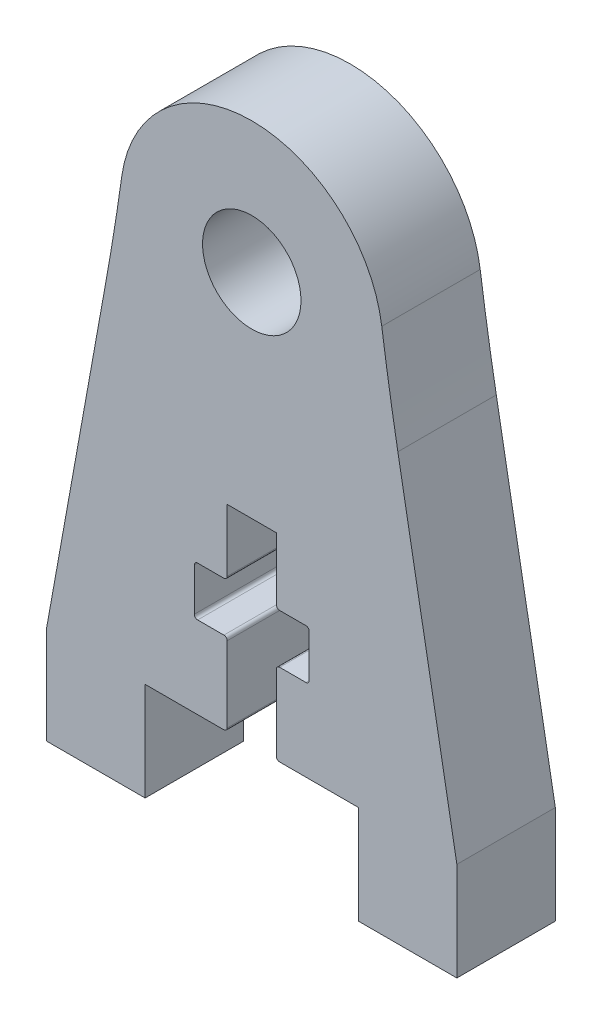
ISO-10303-21;
HEADER;
FILE_DESCRIPTION(('STEP AP214'),'2;1');
FILE_NAME('part.step','',(''),(''),'','','');
FILE_SCHEMA(('AUTOMOTIVE_DESIGN { 1 0 10303 214 1 1 1 1 }'));
ENDSEC;
DATA;
#1=APPLICATION_CONTEXT('core data for automotive mechanical design processes');
#2=APPLICATION_PROTOCOL_DEFINITION('international standard','automotive_design',2000,#1);
#3=PRODUCT_CONTEXT('',#1,'mechanical');
#4=PRODUCT('Part','Part','',(#3));
#5=PRODUCT_RELATED_PRODUCT_CATEGORY('part','',(#4));
#6=PRODUCT_DEFINITION_FORMATION('','',#4);
#7=PRODUCT_DEFINITION_CONTEXT('part definition',#1,'design');
#8=PRODUCT_DEFINITION('design','',#6,#7);
#9=PRODUCT_DEFINITION_SHAPE('','',#8);
#10=(LENGTH_UNIT() NAMED_UNIT(*) SI_UNIT(.MILLI.,.METRE.));
#11=(NAMED_UNIT(*) PLANE_ANGLE_UNIT() SI_UNIT($,.RADIAN.));
#12=(NAMED_UNIT(*) SI_UNIT($,.STERADIAN.) SOLID_ANGLE_UNIT());
#13=UNCERTAINTY_MEASURE_WITH_UNIT(LENGTH_MEASURE(1.E-05),#10,'distance_accuracy_value','');
#14=(GEOMETRIC_REPRESENTATION_CONTEXT(3) GLOBAL_UNCERTAINTY_ASSIGNED_CONTEXT((#13)) GLOBAL_UNIT_ASSIGNED_CONTEXT((#10,
#11,#12)) REPRESENTATION_CONTEXT('',''));
#15=CARTESIAN_POINT('',(0.,0.,0.));
#16=DIRECTION('',(0.,0.,1.));
#17=DIRECTION('',(1.,0.,0.));
#18=AXIS2_PLACEMENT_3D('',#15,#16,#17);
#19=CARTESIAN_POINT('',(0.,0.,6.));
#20=DIRECTION('',(0.,1.,0.));
#21=DIRECTION('',(0.,0.,1.));
#22=AXIS2_PLACEMENT_3D('',#19,#20,#21);
#23=PLANE('',#22);
#24=DIRECTION('',(1.,0.,0.));
#25=VECTOR('',#24,1.);
#26=CARTESIAN_POINT('',(0.,0.,6.));
#27=LINE('',#26,#25);
#28=CARTESIAN_POINT('',(-10.8,0.,6.));
#29=VERTEX_POINT('',#28);
#30=CARTESIAN_POINT('',(-6.,0.,6.));
#31=VERTEX_POINT('',#30);
#32=EDGE_CURVE('E474',#29,#31,#27,.T.);
#33=ORIENTED_EDGE('',*,*,#32,.F.);
#34=DIRECTION('',(0.,0.,1.));
#35=VECTOR('',#34,1.);
#36=CARTESIAN_POINT('',(-10.8,0.,6.));
#37=LINE('',#36,#35);
#38=CARTESIAN_POINT('',(-10.8,0.,0.));
#39=VERTEX_POINT('',#38);
#40=EDGE_CURVE('E516',#29,#39,#37,.F.);
#41=ORIENTED_EDGE('',*,*,#40,.T.);
#42=DIRECTION('',(1.,0.,0.));
#43=VECTOR('',#42,1.);
#44=CARTESIAN_POINT('',(0.,0.,0.));
#45=LINE('',#44,#43);
#46=CARTESIAN_POINT('',(-6.,0.,0.));
#47=VERTEX_POINT('',#46);
#48=EDGE_CURVE('E485',#39,#47,#45,.T.);
#49=ORIENTED_EDGE('',*,*,#48,.T.);
#50=DIRECTION('',(0.,0.,-1.));
#51=VECTOR('',#50,1.);
#52=CARTESIAN_POINT('',(-6.,0.,6.));
#53=LINE('',#52,#51);
#54=EDGE_CURVE('E278',#31,#47,#53,.T.);
#55=ORIENTED_EDGE('',*,*,#54,.F.);
#56=EDGE_LOOP('',(#33,#41,#49,#55));
#57=FACE_BOUND('',#56,.T.);
#58=ADVANCED_FACE('F33',(#57),#23,.F.);
#59=CARTESIAN_POINT('',(-19.,0.,0.));
#60=VERTEX_POINT('',#59);
#61=CARTESIAN_POINT('',(-14.2,0.,0.));
#62=VERTEX_POINT('',#61);
#63=EDGE_CURVE('E469',#60,#62,#45,.T.);
#64=ORIENTED_EDGE('',*,*,#63,.T.);
#65=DIRECTION('',(0.,0.,1.));
#66=VECTOR('',#65,1.);
#67=CARTESIAN_POINT('',(-14.2,0.,6.));
#68=LINE('',#67,#66);
#69=CARTESIAN_POINT('',(-14.2,0.,6.));
#70=VERTEX_POINT('',#69);
#71=EDGE_CURVE('E41',#62,#70,#68,.T.);
#72=ORIENTED_EDGE('',*,*,#71,.T.);
#73=CARTESIAN_POINT('',(-19.,0.,6.));
#74=VERTEX_POINT('',#73);
#75=EDGE_CURVE('E475',#74,#70,#27,.T.);
#76=ORIENTED_EDGE('',*,*,#75,.F.);
#77=DIRECTION('',(0.,0.,1.));
#78=VECTOR('',#77,1.);
#79=CARTESIAN_POINT('',(-19.,0.,6.));
#80=LINE('',#79,#78);
#81=EDGE_CURVE('E283',#60,#74,#80,.T.);
#82=ORIENTED_EDGE('',*,*,#81,.F.);
#83=EDGE_LOOP('',(#64,#72,#76,#82));
#84=FACE_BOUND('',#83,.T.);
#85=ADVANCED_FACE('F523',(#84),#23,.F.);
#86=CARTESIAN_POINT('',(-12.5,25.,6.));
#87=DIRECTION('',(0.,0.,-1.));
#88=DIRECTION('',(-1.,0.,0.));
#89=AXIS2_PLACEMENT_3D('',#86,#87,#88);
#90=PLANE('',#89);
#91=DIRECTION('',(0.,1.,0.));
#92=VECTOR('',#91,1.);
#93=CARTESIAN_POINT('',(-11.,4.8,6.));
#94=LINE('',#93,#92);
#95=CARTESIAN_POINT('',(-11.,0.2,6.));
#96=VERTEX_POINT('',#95);
#97=CARTESIAN_POINT('',(-11.,4.8,6.));
#98=VERTEX_POINT('',#97);
#99=EDGE_CURVE('E312',#96,#98,#94,.T.);
#100=ORIENTED_EDGE('',*,*,#99,.F.);
#101=CARTESIAN_POINT('',(-10.8,0.2,6.));
#102=DIRECTION('',(0.,0.,-1.));
#103=DIRECTION('',(-1.,0.,0.));
#104=AXIS2_PLACEMENT_3D('',#101,#102,#103);
#105=CIRCLE('',#104,0.2);
#106=EDGE_CURVE('E514',#96,#29,#105,.F.);
#107=ORIENTED_EDGE('',*,*,#106,.T.);
#108=ORIENTED_EDGE('',*,*,#32,.T.);
#109=DIRECTION('',(0.,1.,0.));
#110=VECTOR('',#109,1.);
#111=CARTESIAN_POINT('',(-6.,-6.,6.));
#112=LINE('',#111,#110);
#113=CARTESIAN_POINT('',(-6.,-6.,6.));
#114=VERTEX_POINT('',#113);
#115=EDGE_CURVE('E265',#114,#31,#112,.T.);
#116=ORIENTED_EDGE('',*,*,#115,.F.);
#117=DIRECTION('',(-1.,0.,0.));
#118=VECTOR('',#117,1.);
#119=CARTESIAN_POINT('',(0.,-6.,6.));
#120=LINE('',#119,#118);
#121=CARTESIAN_POINT('',(0.,-6.,6.));
#122=VERTEX_POINT('',#121);
#123=EDGE_CURVE('E255',#122,#114,#120,.T.);
#124=ORIENTED_EDGE('',*,*,#123,.F.);
#125=DIRECTION('',(0.,1.,0.));
#126=VECTOR('',#125,1.);
#127=CARTESIAN_POINT('',(0.,-6.,6.));
#128=LINE('',#127,#126);
#129=CARTESIAN_POINT('',(0.,0.,6.));
#130=VERTEX_POINT('',#129);
#131=EDGE_CURVE('E262',#122,#130,#128,.T.);
#132=ORIENTED_EDGE('',*,*,#131,.T.);
#133=DIRECTION('',(-0.177152998315265,0.984183323973695,0.));
#134=VECTOR('',#133,1.);
#135=CARTESIAN_POINT('',(-4.5,25.,6.));
#136=LINE('',#135,#134);
#137=CARTESIAN_POINT('',(-3.5961798990472,19.9787772169289,6.));
#138=VERTEX_POINT('',#137);
#139=EDGE_CURVE('E466',#130,#138,#136,.T.);
#140=ORIENTED_EDGE('',*,*,#139,.T.);
#141=CARTESIAN_POINT('',(153.873151936744,48.3232569473713,6.));
#142=DIRECTION('',(0.,0.,-1.));
#143=DIRECTION('',(-1.,0.,0.));
#144=AXIS2_PLACEMENT_3D('',#141,#142,#143);
#145=CIRCLE('',#144,160.);
#146=CARTESIAN_POINT('',(-4.57746895539314,26.1106312832082,6.));
#147=VERTEX_POINT('',#146);
#148=EDGE_CURVE('E507',#138,#147,#145,.T.);
#149=ORIENTED_EDGE('',*,*,#148,.T.);
#150=CARTESIAN_POINT('',(-12.5,25.,6.));
#151=DIRECTION('',(0.,0.,1.));
#152=DIRECTION('',(-1.,0.,0.));
#153=AXIS2_PLACEMENT_3D('',#150,#151,#152);
#154=CIRCLE('',#153,8.);
#155=CARTESIAN_POINT('',(-20.4225310446068,26.1106312832083,6.));
#156=VERTEX_POINT('',#155);
#157=EDGE_CURVE('E468',#147,#156,#154,.T.);
#158=ORIENTED_EDGE('',*,*,#157,.T.);
#159=CARTESIAN_POINT('',(-178.873151936744,48.3232569473734,6.));
#160=DIRECTION('',(0.,0.,-1.));
#161=DIRECTION('',(-1.,0.,0.));
#162=AXIS2_PLACEMENT_3D('',#159,#160,#161);
#163=CIRCLE('',#162,160.);
#164=CARTESIAN_POINT('',(-21.4038201009524,19.978777216931,6.));
#165=VERTEX_POINT('',#164);
#166=EDGE_CURVE('E503',#156,#165,#163,.T.);
#167=ORIENTED_EDGE('',*,*,#166,.T.);
#168=DIRECTION('',(-0.177152998315265,-0.984183323973695,0.));
#169=VECTOR('',#168,1.);
#170=CARTESIAN_POINT('',(-25.,0.,6.));
#171=LINE('',#170,#169);
#172=CARTESIAN_POINT('',(-25.,0.,6.));
#173=VERTEX_POINT('',#172);
#174=EDGE_CURVE('E472',#165,#173,#171,.T.);
#175=ORIENTED_EDGE('',*,*,#174,.T.);
#176=DIRECTION('',(0.,1.,0.));
#177=VECTOR('',#176,1.);
#178=CARTESIAN_POINT('',(-25.,-6.,6.));
#179=LINE('',#178,#177);
#180=CARTESIAN_POINT('',(-25.,-6.,6.));
#181=VERTEX_POINT('',#180);
#182=EDGE_CURVE('E299',#181,#173,#179,.T.);
#183=ORIENTED_EDGE('',*,*,#182,.F.);
#184=DIRECTION('',(-1.,0.,0.));
#185=VECTOR('',#184,1.);
#186=CARTESIAN_POINT('',(-25.,-6.,6.));
#187=LINE('',#186,#185);
#188=CARTESIAN_POINT('',(-19.,-6.,6.));
#189=VERTEX_POINT('',#188);
#190=EDGE_CURVE('E298',#189,#181,#187,.T.);
#191=ORIENTED_EDGE('',*,*,#190,.F.);
#192=DIRECTION('',(0.,1.,0.));
#193=VECTOR('',#192,1.);
#194=CARTESIAN_POINT('',(-19.,-6.,6.));
#195=LINE('',#194,#193);
#196=EDGE_CURVE('E303',#189,#74,#195,.T.);
#197=ORIENTED_EDGE('',*,*,#196,.T.);
#198=ORIENTED_EDGE('',*,*,#75,.T.);
#199=CARTESIAN_POINT('',(-14.2,0.2,6.));
#200=DIRECTION('',(0.,0.,-1.));
#201=DIRECTION('',(-1.,0.,0.));
#202=AXIS2_PLACEMENT_3D('',#199,#200,#201);
#203=CIRCLE('',#202,0.2);
#204=CARTESIAN_POINT('',(-14.,0.2,6.));
#205=VERTEX_POINT('',#204);
#206=EDGE_CURVE('E512',#70,#205,#203,.F.);
#207=ORIENTED_EDGE('',*,*,#206,.T.);
#208=DIRECTION('',(0.,-1.,0.));
#209=VECTOR('',#208,1.);
#210=CARTESIAN_POINT('',(-14.,0.,6.));
#211=LINE('',#210,#209);
#212=CARTESIAN_POINT('',(-14.,4.8,6.));
#213=VERTEX_POINT('',#212);
#214=EDGE_CURVE('E316',#213,#205,#211,.T.);
#215=ORIENTED_EDGE('',*,*,#214,.F.);
#216=CARTESIAN_POINT('',(-14.2,4.8,6.));
#217=DIRECTION('',(0.,0.,-1.));
#218=DIRECTION('',(1.,0.,0.));
#219=AXIS2_PLACEMENT_3D('',#216,#217,#218);
#220=CIRCLE('',#219,0.2);
#221=CARTESIAN_POINT('',(-14.2,5.,6.));
#222=VERTEX_POINT('',#221);
#223=EDGE_CURVE('E419',#222,#213,#220,.T.);
#224=ORIENTED_EDGE('',*,*,#223,.F.);
#225=DIRECTION('',(1.,0.,0.));
#226=VECTOR('',#225,1.);
#227=CARTESIAN_POINT('',(-14.2,5.,6.));
#228=LINE('',#227,#226);
#229=CARTESIAN_POINT('',(-15.8,5.,6.));
#230=VERTEX_POINT('',#229);
#231=EDGE_CURVE('E416',#230,#222,#228,.T.);
#232=ORIENTED_EDGE('',*,*,#231,.F.);
#233=CARTESIAN_POINT('',(-15.8,5.2,6.));
#234=DIRECTION('',(0.,0.,1.));
#235=DIRECTION('',(1.,0.,0.));
#236=AXIS2_PLACEMENT_3D('',#233,#234,#235);
#237=CIRCLE('',#236,0.199999999999999);
#238=CARTESIAN_POINT('',(-16.,5.2,6.));
#239=VERTEX_POINT('',#238);
#240=EDGE_CURVE('E413',#239,#230,#237,.T.);
#241=ORIENTED_EDGE('',*,*,#240,.F.);
#242=DIRECTION('',(0.,-1.,0.));
#243=VECTOR('',#242,1.);
#244=CARTESIAN_POINT('',(-16.,5.2,6.));
#245=LINE('',#244,#243);
#246=CARTESIAN_POINT('',(-16.,7.8,6.));
#247=VERTEX_POINT('',#246);
#248=EDGE_CURVE('E410',#247,#239,#245,.T.);
#249=ORIENTED_EDGE('',*,*,#248,.F.);
#250=CARTESIAN_POINT('',(-15.8,7.8,6.));
#251=DIRECTION('',(0.,0.,1.));
#252=DIRECTION('',(-1.,0.,0.));
#253=AXIS2_PLACEMENT_3D('',#250,#251,#252);
#254=CIRCLE('',#253,0.199999999999999);
#255=CARTESIAN_POINT('',(-15.8,8.,6.));
#256=VERTEX_POINT('',#255);
#257=EDGE_CURVE('E407',#256,#247,#254,.T.);
#258=ORIENTED_EDGE('',*,*,#257,.F.);
#259=DIRECTION('',(-1.,0.,0.));
#260=VECTOR('',#259,1.);
#261=CARTESIAN_POINT('',(-15.8,8.,6.));
#262=LINE('',#261,#260);
#263=CARTESIAN_POINT('',(-14.2,8.,6.));
#264=VERTEX_POINT('',#263);
#265=EDGE_CURVE('E404',#264,#256,#262,.T.);
#266=ORIENTED_EDGE('',*,*,#265,.F.);
#267=CARTESIAN_POINT('',(-14.2,8.2,6.));
#268=DIRECTION('',(0.,0.,-1.));
#269=DIRECTION('',(1.,0.,0.));
#270=AXIS2_PLACEMENT_3D('',#267,#268,#269);
#271=CIRCLE('',#270,0.200000000000001);
#272=CARTESIAN_POINT('',(-14.,8.2,6.));
#273=VERTEX_POINT('',#272);
#274=EDGE_CURVE('E401',#273,#264,#271,.T.);
#275=ORIENTED_EDGE('',*,*,#274,.F.);
#276=DIRECTION('',(0.,-1.,0.));
#277=VECTOR('',#276,1.);
#278=CARTESIAN_POINT('',(-14.,8.2,6.));
#279=LINE('',#278,#277);
#280=CARTESIAN_POINT('',(-14.,12.,6.));
#281=VERTEX_POINT('',#280);
#282=EDGE_CURVE('E398',#281,#273,#279,.T.);
#283=ORIENTED_EDGE('',*,*,#282,.F.);
#284=DIRECTION('',(-1.,0.,0.));
#285=VECTOR('',#284,1.);
#286=CARTESIAN_POINT('',(-14.,12.,6.));
#287=LINE('',#286,#285);
#288=CARTESIAN_POINT('',(-11.,12.,6.));
#289=VERTEX_POINT('',#288);
#290=EDGE_CURVE('E395',#289,#281,#287,.T.);
#291=ORIENTED_EDGE('',*,*,#290,.F.);
#292=DIRECTION('',(0.,1.,0.));
#293=VECTOR('',#292,1.);
#294=CARTESIAN_POINT('',(-11.,12.,6.));
#295=LINE('',#294,#293);
#296=CARTESIAN_POINT('',(-11.,8.2,6.));
#297=VERTEX_POINT('',#296);
#298=EDGE_CURVE('E392',#297,#289,#295,.T.);
#299=ORIENTED_EDGE('',*,*,#298,.F.);
#300=CARTESIAN_POINT('',(-10.8,8.2,6.));
#301=DIRECTION('',(0.,0.,-1.));
#302=DIRECTION('',(1.,0.,0.));
#303=AXIS2_PLACEMENT_3D('',#300,#301,#302);
#304=CIRCLE('',#303,0.2);
#305=CARTESIAN_POINT('',(-10.8,8.,6.));
#306=VERTEX_POINT('',#305);
#307=EDGE_CURVE('E389',#306,#297,#304,.T.);
#308=ORIENTED_EDGE('',*,*,#307,.F.);
#309=DIRECTION('',(-1.,0.,0.));
#310=VECTOR('',#309,1.);
#311=CARTESIAN_POINT('',(-10.8,8.,6.));
#312=LINE('',#311,#310);
#313=CARTESIAN_POINT('',(-9.2,8.,6.));
#314=VERTEX_POINT('',#313);
#315=EDGE_CURVE('E386',#314,#306,#312,.T.);
#316=ORIENTED_EDGE('',*,*,#315,.F.);
#317=CARTESIAN_POINT('',(-9.2,7.8,6.));
#318=DIRECTION('',(0.,0.,1.));
#319=DIRECTION('',(1.,0.,0.));
#320=AXIS2_PLACEMENT_3D('',#317,#318,#319);
#321=CIRCLE('',#320,0.2);
#322=CARTESIAN_POINT('',(-9.,7.8,6.));
#323=VERTEX_POINT('',#322);
#324=EDGE_CURVE('E383',#323,#314,#321,.T.);
#325=ORIENTED_EDGE('',*,*,#324,.F.);
#326=DIRECTION('',(0.,1.,0.));
#327=VECTOR('',#326,1.);
#328=CARTESIAN_POINT('',(-9.,7.8,6.));
#329=LINE('',#328,#327);
#330=CARTESIAN_POINT('',(-9.,5.2,6.));
#331=VERTEX_POINT('',#330);
#332=EDGE_CURVE('E380',#331,#323,#329,.T.);
#333=ORIENTED_EDGE('',*,*,#332,.F.);
#334=CARTESIAN_POINT('',(-9.2,5.2,6.));
#335=DIRECTION('',(0.,0.,1.));
#336=DIRECTION('',(-1.,0.,0.));
#337=AXIS2_PLACEMENT_3D('',#334,#335,#336);
#338=CIRCLE('',#337,0.2);
#339=CARTESIAN_POINT('',(-9.2,5.,6.));
#340=VERTEX_POINT('',#339);
#341=EDGE_CURVE('E377',#340,#331,#338,.T.);
#342=ORIENTED_EDGE('',*,*,#341,.F.);
#343=DIRECTION('',(1.,0.,0.));
#344=VECTOR('',#343,1.);
#345=CARTESIAN_POINT('',(-9.2,5.,6.));
#346=LINE('',#345,#344);
#347=CARTESIAN_POINT('',(-10.8,5.,6.));
#348=VERTEX_POINT('',#347);
#349=EDGE_CURVE('E374',#348,#340,#346,.T.);
#350=ORIENTED_EDGE('',*,*,#349,.F.);
#351=CARTESIAN_POINT('',(-10.8,4.8,6.));
#352=DIRECTION('',(0.,0.,-1.));
#353=DIRECTION('',(1.,0.,0.));
#354=AXIS2_PLACEMENT_3D('',#351,#352,#353);
#355=CIRCLE('',#354,0.2);
#356=EDGE_CURVE('E371',#98,#348,#355,.T.);
#357=ORIENTED_EDGE('',*,*,#356,.F.);
#358=EDGE_LOOP('',(#100,#107,#108,#116,#124,#132,#140,#149,#158,#167,#175,#183,#191,#197,#198,
#207,#215,#224,#232,#241,#249,#258,#266,#275,#283,#291,#299,#308,#316,#325,#333,#342,#350,#357));
#359=FACE_BOUND('',#358,.T.);
#360=CARTESIAN_POINT('',(-12.5,25.,6.));
#361=DIRECTION('',(0.,0.,1.));
#362=DIRECTION('',(1.,0.,0.));
#363=AXIS2_PLACEMENT_3D('',#360,#361,#362);
#364=CIRCLE('',#363,3.);
#365=CARTESIAN_POINT('',(-9.5,25.,6.));
#366=VERTEX_POINT('',#365);
#367=EDGE_CURVE('E460',#366,#366,#364,.T.);
#368=ORIENTED_EDGE('',*,*,#367,.F.);
#369=EDGE_LOOP('',(#368));
#370=FACE_BOUND('',#369,.T.);
#371=ADVANCED_FACE('F258',(#359,#370),#90,.F.);
#372=CARTESIAN_POINT('',(-12.5,25.,0.));
#373=DIRECTION('',(0.,0.,-1.));
#374=DIRECTION('',(-1.,0.,0.));
#375=AXIS2_PLACEMENT_3D('',#372,#373,#374);
#376=PLANE('',#375);
#377=ORIENTED_EDGE('',*,*,#48,.F.);
#378=CARTESIAN_POINT('',(-10.8,0.2,0.));
#379=DIRECTION('',(0.,0.,-1.));
#380=DIRECTION('',(-1.,0.,0.));
#381=AXIS2_PLACEMENT_3D('',#378,#379,#380);
#382=CIRCLE('',#381,0.2);
#383=CARTESIAN_POINT('',(-11.,0.2,0.));
#384=VERTEX_POINT('',#383);
#385=EDGE_CURVE('E519',#39,#384,#382,.T.);
#386=ORIENTED_EDGE('',*,*,#385,.T.);
#387=DIRECTION('',(0.,1.,0.));
#388=VECTOR('',#387,1.);
#389=CARTESIAN_POINT('',(-11.,4.8,0.));
#390=LINE('',#389,#388);
#391=CARTESIAN_POINT('',(-11.,4.8,0.));
#392=VERTEX_POINT('',#391);
#393=EDGE_CURVE('E313',#384,#392,#390,.T.);
#394=ORIENTED_EDGE('',*,*,#393,.T.);
#395=CARTESIAN_POINT('',(-10.8,4.8,0.));
#396=DIRECTION('',(0.,0.,-1.));
#397=DIRECTION('',(1.,0.,0.));
#398=AXIS2_PLACEMENT_3D('',#395,#396,#397);
#399=CIRCLE('',#398,0.2);
#400=CARTESIAN_POINT('',(-10.8,5.,0.));
#401=VERTEX_POINT('',#400);
#402=EDGE_CURVE('E315',#392,#401,#399,.T.);
#403=ORIENTED_EDGE('',*,*,#402,.T.);
#404=DIRECTION('',(1.,0.,0.));
#405=VECTOR('',#404,1.);
#406=CARTESIAN_POINT('',(-9.2,5.,0.));
#407=LINE('',#406,#405);
#408=CARTESIAN_POINT('',(-9.2,5.,0.));
#409=VERTEX_POINT('',#408);
#410=EDGE_CURVE('E319',#401,#409,#407,.T.);
#411=ORIENTED_EDGE('',*,*,#410,.T.);
#412=CARTESIAN_POINT('',(-9.2,5.2,0.));
#413=DIRECTION('',(0.,0.,1.));
#414=DIRECTION('',(-1.,0.,0.));
#415=AXIS2_PLACEMENT_3D('',#412,#413,#414);
#416=CIRCLE('',#415,0.2);
#417=CARTESIAN_POINT('',(-9.,5.2,0.));
#418=VERTEX_POINT('',#417);
#419=EDGE_CURVE('E322',#409,#418,#416,.T.);
#420=ORIENTED_EDGE('',*,*,#419,.T.);
#421=DIRECTION('',(0.,1.,0.));
#422=VECTOR('',#421,1.);
#423=CARTESIAN_POINT('',(-9.,7.8,0.));
#424=LINE('',#423,#422);
#425=CARTESIAN_POINT('',(-9.,7.8,0.));
#426=VERTEX_POINT('',#425);
#427=EDGE_CURVE('E325',#418,#426,#424,.T.);
#428=ORIENTED_EDGE('',*,*,#427,.T.);
#429=CARTESIAN_POINT('',(-9.2,7.8,0.));
#430=DIRECTION('',(0.,0.,1.));
#431=DIRECTION('',(1.,0.,0.));
#432=AXIS2_PLACEMENT_3D('',#429,#430,#431);
#433=CIRCLE('',#432,0.2);
#434=CARTESIAN_POINT('',(-9.2,8.,0.));
#435=VERTEX_POINT('',#434);
#436=EDGE_CURVE('E328',#426,#435,#433,.T.);
#437=ORIENTED_EDGE('',*,*,#436,.T.);
#438=DIRECTION('',(-1.,0.,0.));
#439=VECTOR('',#438,1.);
#440=CARTESIAN_POINT('',(-10.8,8.,0.));
#441=LINE('',#440,#439);
#442=CARTESIAN_POINT('',(-10.8,8.,0.));
#443=VERTEX_POINT('',#442);
#444=EDGE_CURVE('E331',#435,#443,#441,.T.);
#445=ORIENTED_EDGE('',*,*,#444,.T.);
#446=CARTESIAN_POINT('',(-10.8,8.2,0.));
#447=DIRECTION('',(0.,0.,-1.));
#448=DIRECTION('',(1.,0.,0.));
#449=AXIS2_PLACEMENT_3D('',#446,#447,#448);
#450=CIRCLE('',#449,0.2);
#451=CARTESIAN_POINT('',(-11.,8.2,0.));
#452=VERTEX_POINT('',#451);
#453=EDGE_CURVE('E334',#443,#452,#450,.T.);
#454=ORIENTED_EDGE('',*,*,#453,.T.);
#455=DIRECTION('',(0.,1.,0.));
#456=VECTOR('',#455,1.);
#457=CARTESIAN_POINT('',(-11.,12.,0.));
#458=LINE('',#457,#456);
#459=CARTESIAN_POINT('',(-11.,12.,0.));
#460=VERTEX_POINT('',#459);
#461=EDGE_CURVE('E337',#452,#460,#458,.T.);
#462=ORIENTED_EDGE('',*,*,#461,.T.);
#463=DIRECTION('',(-1.,0.,0.));
#464=VECTOR('',#463,1.);
#465=CARTESIAN_POINT('',(-14.,12.,0.));
#466=LINE('',#465,#464);
#467=CARTESIAN_POINT('',(-14.,12.,0.));
#468=VERTEX_POINT('',#467);
#469=EDGE_CURVE('E340',#460,#468,#466,.T.);
#470=ORIENTED_EDGE('',*,*,#469,.T.);
#471=DIRECTION('',(0.,-1.,0.));
#472=VECTOR('',#471,1.);
#473=CARTESIAN_POINT('',(-14.,8.2,0.));
#474=LINE('',#473,#472);
#475=CARTESIAN_POINT('',(-14.,8.2,0.));
#476=VERTEX_POINT('',#475);
#477=EDGE_CURVE('E343',#468,#476,#474,.T.);
#478=ORIENTED_EDGE('',*,*,#477,.T.);
#479=CARTESIAN_POINT('',(-14.2,8.2,0.));
#480=DIRECTION('',(0.,0.,-1.));
#481=DIRECTION('',(1.,0.,0.));
#482=AXIS2_PLACEMENT_3D('',#479,#480,#481);
#483=CIRCLE('',#482,0.200000000000001);
#484=CARTESIAN_POINT('',(-14.2,8.,0.));
#485=VERTEX_POINT('',#484);
#486=EDGE_CURVE('E346',#476,#485,#483,.T.);
#487=ORIENTED_EDGE('',*,*,#486,.T.);
#488=DIRECTION('',(-1.,0.,0.));
#489=VECTOR('',#488,1.);
#490=CARTESIAN_POINT('',(-15.8,8.,0.));
#491=LINE('',#490,#489);
#492=CARTESIAN_POINT('',(-15.8,8.,0.));
#493=VERTEX_POINT('',#492);
#494=EDGE_CURVE('E349',#485,#493,#491,.T.);
#495=ORIENTED_EDGE('',*,*,#494,.T.);
#496=CARTESIAN_POINT('',(-15.8,7.8,0.));
#497=DIRECTION('',(0.,0.,1.));
#498=DIRECTION('',(-1.,0.,0.));
#499=AXIS2_PLACEMENT_3D('',#496,#497,#498);
#500=CIRCLE('',#499,0.199999999999999);
#501=CARTESIAN_POINT('',(-16.,7.8,0.));
#502=VERTEX_POINT('',#501);
#503=EDGE_CURVE('E352',#493,#502,#500,.T.);
#504=ORIENTED_EDGE('',*,*,#503,.T.);
#505=DIRECTION('',(0.,-1.,0.));
#506=VECTOR('',#505,1.);
#507=CARTESIAN_POINT('',(-16.,5.2,0.));
#508=LINE('',#507,#506);
#509=CARTESIAN_POINT('',(-16.,5.2,0.));
#510=VERTEX_POINT('',#509);
#511=EDGE_CURVE('E355',#502,#510,#508,.T.);
#512=ORIENTED_EDGE('',*,*,#511,.T.);
#513=CARTESIAN_POINT('',(-15.8,5.2,0.));
#514=DIRECTION('',(0.,0.,1.));
#515=DIRECTION('',(1.,0.,0.));
#516=AXIS2_PLACEMENT_3D('',#513,#514,#515);
#517=CIRCLE('',#516,0.199999999999999);
#518=CARTESIAN_POINT('',(-15.8,5.,0.));
#519=VERTEX_POINT('',#518);
#520=EDGE_CURVE('E358',#510,#519,#517,.T.);
#521=ORIENTED_EDGE('',*,*,#520,.T.);
#522=DIRECTION('',(1.,0.,0.));
#523=VECTOR('',#522,1.);
#524=CARTESIAN_POINT('',(-14.2,5.,0.));
#525=LINE('',#524,#523);
#526=CARTESIAN_POINT('',(-14.2,5.,0.));
#527=VERTEX_POINT('',#526);
#528=EDGE_CURVE('E361',#519,#527,#525,.T.);
#529=ORIENTED_EDGE('',*,*,#528,.T.);
#530=CARTESIAN_POINT('',(-14.2,4.8,0.));
#531=DIRECTION('',(0.,0.,-1.));
#532=DIRECTION('',(1.,0.,0.));
#533=AXIS2_PLACEMENT_3D('',#530,#531,#532);
#534=CIRCLE('',#533,0.2);
#535=CARTESIAN_POINT('',(-14.,4.8,0.));
#536=VERTEX_POINT('',#535);
#537=EDGE_CURVE('E364',#527,#536,#534,.T.);
#538=ORIENTED_EDGE('',*,*,#537,.T.);
#539=DIRECTION('',(0.,-1.,0.));
#540=VECTOR('',#539,1.);
#541=CARTESIAN_POINT('',(-14.,0.,0.));
#542=LINE('',#541,#540);
#543=CARTESIAN_POINT('',(-14.,0.2,0.));
#544=VERTEX_POINT('',#543);
#545=EDGE_CURVE('E367',#536,#544,#542,.T.);
#546=ORIENTED_EDGE('',*,*,#545,.T.);
#547=CARTESIAN_POINT('',(-14.2,0.2,0.));
#548=DIRECTION('',(0.,0.,-1.));
#549=DIRECTION('',(-1.,0.,0.));
#550=AXIS2_PLACEMENT_3D('',#547,#548,#549);
#551=CIRCLE('',#550,0.2);
#552=EDGE_CURVE('E48',#544,#62,#551,.T.);
#553=ORIENTED_EDGE('',*,*,#552,.T.);
#554=ORIENTED_EDGE('',*,*,#63,.F.);
#555=DIRECTION('',(0.,1.,0.));
#556=VECTOR('',#555,1.);
#557=CARTESIAN_POINT('',(-19.,-6.,0.));
#558=LINE('',#557,#556);
#559=CARTESIAN_POINT('',(-19.,-6.,0.));
#560=VERTEX_POINT('',#559);
#561=EDGE_CURVE('E306',#560,#60,#558,.T.);
#562=ORIENTED_EDGE('',*,*,#561,.F.);
#563=DIRECTION('',(1.,0.,0.));
#564=VECTOR('',#563,1.);
#565=CARTESIAN_POINT('',(-25.,-6.,0.));
#566=LINE('',#565,#564);
#567=CARTESIAN_POINT('',(-25.,-6.,0.));
#568=VERTEX_POINT('',#567);
#569=EDGE_CURVE('E294',#568,#560,#566,.T.);
#570=ORIENTED_EDGE('',*,*,#569,.F.);
#571=DIRECTION('',(0.,1.,0.));
#572=VECTOR('',#571,1.);
#573=CARTESIAN_POINT('',(-25.,-6.,0.));
#574=LINE('',#573,#572);
#575=CARTESIAN_POINT('',(-25.,0.,0.));
#576=VERTEX_POINT('',#575);
#577=EDGE_CURVE('E309',#568,#576,#574,.T.);
#578=ORIENTED_EDGE('',*,*,#577,.T.);
#579=DIRECTION('',(-0.177152998315265,-0.984183323973695,0.));
#580=VECTOR('',#579,1.);
#581=CARTESIAN_POINT('',(-25.,0.,0.));
#582=LINE('',#581,#580);
#583=CARTESIAN_POINT('',(-21.4038201009524,19.978777216931,0.));
#584=VERTEX_POINT('',#583);
#585=EDGE_CURVE('E483',#584,#576,#582,.T.);
#586=ORIENTED_EDGE('',*,*,#585,.F.);
#587=CARTESIAN_POINT('',(-178.873151936744,48.3232569473734,0.));
#588=DIRECTION('',(0.,0.,-1.));
#589=DIRECTION('',(-1.,0.,0.));
#590=AXIS2_PLACEMENT_3D('',#587,#588,#589);
#591=CIRCLE('',#590,160.);
#592=CARTESIAN_POINT('',(-20.4225310446068,26.1106312832083,0.));
#593=VERTEX_POINT('',#592);
#594=EDGE_CURVE('E501',#584,#593,#591,.F.);
#595=ORIENTED_EDGE('',*,*,#594,.T.);
#596=CARTESIAN_POINT('',(-12.5,25.,0.));
#597=DIRECTION('',(0.,0.,1.));
#598=DIRECTION('',(-1.,0.,0.));
#599=AXIS2_PLACEMENT_3D('',#596,#597,#598);
#600=CIRCLE('',#599,8.);
#601=CARTESIAN_POINT('',(-4.57746895539314,26.1106312832082,0.));
#602=VERTEX_POINT('',#601);
#603=EDGE_CURVE('E480',#602,#593,#600,.T.);
#604=ORIENTED_EDGE('',*,*,#603,.F.);
#605=CARTESIAN_POINT('',(153.873151936744,48.3232569473713,0.));
#606=DIRECTION('',(0.,0.,-1.));
#607=DIRECTION('',(-1.,0.,0.));
#608=AXIS2_PLACEMENT_3D('',#605,#606,#607);
#609=CIRCLE('',#608,160.);
#610=CARTESIAN_POINT('',(-3.5961798990472,19.9787772169289,0.));
#611=VERTEX_POINT('',#610);
#612=EDGE_CURVE('E505',#602,#611,#609,.F.);
#613=ORIENTED_EDGE('',*,*,#612,.T.);
#614=DIRECTION('',(-0.177152998315265,0.984183323973695,0.));
#615=VECTOR('',#614,1.);
#616=CARTESIAN_POINT('',(-4.5,25.,0.));
#617=LINE('',#616,#615);
#618=CARTESIAN_POINT('',(0.,0.,0.));
#619=VERTEX_POINT('',#618);
#620=EDGE_CURVE('E463',#619,#611,#617,.T.);
#621=ORIENTED_EDGE('',*,*,#620,.F.);
#622=DIRECTION('',(0.,1.,0.));
#623=VECTOR('',#622,1.);
#624=CARTESIAN_POINT('',(0.,-6.,0.));
#625=LINE('',#624,#623);
#626=CARTESIAN_POINT('',(0.,-6.,0.));
#627=VERTEX_POINT('',#626);
#628=EDGE_CURVE('E563',#627,#619,#625,.T.);
#629=ORIENTED_EDGE('',*,*,#628,.F.);
#630=DIRECTION('',(1.,0.,0.));
#631=VECTOR('',#630,1.);
#632=CARTESIAN_POINT('',(0.,-6.,0.));
#633=LINE('',#632,#631);
#634=CARTESIAN_POINT('',(-6.,-6.,0.));
#635=VERTEX_POINT('',#634);
#636=EDGE_CURVE('E274',#635,#627,#633,.T.);
#637=ORIENTED_EDGE('',*,*,#636,.F.);
#638=DIRECTION('',(0.,1.,0.));
#639=VECTOR('',#638,1.);
#640=CARTESIAN_POINT('',(-6.,-6.,0.));
#641=LINE('',#640,#639);
#642=EDGE_CURVE('E288',#635,#47,#641,.T.);
#643=ORIENTED_EDGE('',*,*,#642,.T.);
#644=EDGE_LOOP('',(#377,#386,#394,#403,#411,#420,#428,#437,#445,#454,#462,#470,#478,#487,#495,
#504,#512,#521,#529,#538,#546,#553,#554,#562,#570,#578,#586,#595,#604,#613,#621,#629,#637,#643));
#645=FACE_BOUND('',#644,.T.);
#646=CARTESIAN_POINT('',(-12.5,25.,0.));
#647=DIRECTION('',(0.,0.,1.));
#648=DIRECTION('',(1.,0.,0.));
#649=AXIS2_PLACEMENT_3D('',#646,#647,#648);
#650=CIRCLE('',#649,3.);
#651=CARTESIAN_POINT('',(-9.5,25.,0.));
#652=VERTEX_POINT('',#651);
#653=EDGE_CURVE('E425',#652,#652,#650,.T.);
#654=ORIENTED_EDGE('',*,*,#653,.T.);
#655=EDGE_LOOP('',(#654));
#656=FACE_BOUND('',#655,.T.);
#657=ADVANCED_FACE('F534',(#645,#656),#376,.T.);
#658=CARTESIAN_POINT('',(-4.5,25.,6.));
#659=DIRECTION('',(-0.984183323973695,-0.177152998315265,0.));
#660=DIRECTION('',(0.177152998315265,-0.984183323973695,0.));
#661=AXIS2_PLACEMENT_3D('',#658,#659,#660);
#662=PLANE('',#661);
#663=ORIENTED_EDGE('',*,*,#620,.T.);
#664=DIRECTION('',(0.,0.,1.));
#665=VECTOR('',#664,1.);
#666=CARTESIAN_POINT('',(-3.59617989904715,19.9787772169289,6.));
#667=LINE('',#666,#665);
#668=EDGE_CURVE('E499',#611,#138,#667,.T.);
#669=ORIENTED_EDGE('',*,*,#668,.T.);
#670=ORIENTED_EDGE('',*,*,#139,.F.);
#671=DIRECTION('',(0.,0.,-1.));
#672=VECTOR('',#671,1.);
#673=CARTESIAN_POINT('',(0.,0.,6.));
#674=LINE('',#673,#672);
#675=EDGE_CURVE('E282',#130,#619,#674,.T.);
#676=ORIENTED_EDGE('',*,*,#675,.T.);
#677=EDGE_LOOP('',(#663,#669,#670,#676));
#678=FACE_BOUND('',#677,.T.);
#679=ADVANCED_FACE('F562',(#678),#662,.F.);
#680=CARTESIAN_POINT('',(-12.5,25.,6.));
#681=DIRECTION('',(0.,0.,-1.));
#682=DIRECTION('',(-1.,0.,0.));
#683=AXIS2_PLACEMENT_3D('',#680,#681,#682);
#684=CYLINDRICAL_SURFACE('',#683,8.);
#685=ORIENTED_EDGE('',*,*,#603,.T.);
#686=DIRECTION('',(0.,0.,-1.));
#687=VECTOR('',#686,1.);
#688=CARTESIAN_POINT('',(-20.4225310446068,26.1106312832083,6.));
#689=LINE('',#688,#687);
#690=EDGE_CURVE('E497',#593,#156,#689,.F.);
#691=ORIENTED_EDGE('',*,*,#690,.T.);
#692=ORIENTED_EDGE('',*,*,#157,.F.);
#693=DIRECTION('',(0.,0.,-1.));
#694=VECTOR('',#693,1.);
#695=CARTESIAN_POINT('',(-4.57746895539314,26.1106312832082,6.));
#696=LINE('',#695,#694);
#697=EDGE_CURVE('E494',#147,#602,#696,.T.);
#698=ORIENTED_EDGE('',*,*,#697,.T.);
#699=EDGE_LOOP('',(#685,#691,#692,#698));
#700=FACE_BOUND('',#699,.T.);
#701=ADVANCED_FACE('F552',(#700),#684,.T.);
#702=CARTESIAN_POINT('',(-25.,0.,6.));
#703=DIRECTION('',(0.984183323973695,-0.177152998315265,0.));
#704=DIRECTION('',(0.177152998315265,0.984183323973695,0.));
#705=AXIS2_PLACEMENT_3D('',#702,#703,#704);
#706=PLANE('',#705);
#707=ORIENTED_EDGE('',*,*,#174,.F.);
#708=DIRECTION('',(0.,0.,1.));
#709=VECTOR('',#708,1.);
#710=CARTESIAN_POINT('',(-21.4038201009524,19.978777216931,0.));
#711=LINE('',#710,#709);
#712=EDGE_CURVE('E491',#165,#584,#711,.F.);
#713=ORIENTED_EDGE('',*,*,#712,.T.);
#714=ORIENTED_EDGE('',*,*,#585,.T.);
#715=DIRECTION('',(0.,0.,-1.));
#716=VECTOR('',#715,1.);
#717=CARTESIAN_POINT('',(-25.,0.,6.));
#718=LINE('',#717,#716);
#719=EDGE_CURVE('E488',#173,#576,#718,.T.);
#720=ORIENTED_EDGE('',*,*,#719,.F.);
#721=EDGE_LOOP('',(#707,#713,#714,#720));
#722=FACE_BOUND('',#721,.T.);
#723=ADVANCED_FACE('F546',(#722),#706,.F.);
#724=CARTESIAN_POINT('',(-12.5,25.,6.));
#725=DIRECTION('',(0.,0.,-1.));
#726=DIRECTION('',(-1.,0.,0.));
#727=AXIS2_PLACEMENT_3D('',#724,#725,#726);
#728=CYLINDRICAL_SURFACE('',#727,3.);
#729=ORIENTED_EDGE('',*,*,#367,.T.);
#730=EDGE_LOOP('',(#729));
#731=FACE_BOUND('',#730,.T.);
#732=ORIENTED_EDGE('',*,*,#653,.F.);
#733=EDGE_LOOP('',(#732));
#734=FACE_BOUND('',#733,.T.);
#735=ADVANCED_FACE('F676',(#731,#734),#728,.F.);
#736=CARTESIAN_POINT('',(-178.873151936744,48.3232569473734,6.));
#737=DIRECTION('',(0.,0.,-1.));
#738=DIRECTION('',(-1.,0.,0.));
#739=AXIS2_PLACEMENT_3D('',#736,#737,#738);
#740=CYLINDRICAL_SURFACE('',#739,160.);
#741=ORIENTED_EDGE('',*,*,#166,.F.);
#742=ORIENTED_EDGE('',*,*,#690,.F.);
#743=ORIENTED_EDGE('',*,*,#594,.F.);
#744=ORIENTED_EDGE('',*,*,#712,.F.);
#745=EDGE_LOOP('',(#741,#742,#743,#744));
#746=FACE_BOUND('',#745,.T.);
#747=ADVANCED_FACE('F556',(#746),#740,.F.);
#748=CARTESIAN_POINT('',(153.873151936744,48.3232569473713,6.));
#749=DIRECTION('',(0.,0.,-1.));
#750=DIRECTION('',(-1.,0.,0.));
#751=AXIS2_PLACEMENT_3D('',#748,#749,#750);
#752=CYLINDRICAL_SURFACE('',#751,160.);
#753=ORIENTED_EDGE('',*,*,#148,.F.);
#754=ORIENTED_EDGE('',*,*,#668,.F.);
#755=ORIENTED_EDGE('',*,*,#612,.F.);
#756=ORIENTED_EDGE('',*,*,#697,.F.);
#757=EDGE_LOOP('',(#753,#754,#755,#756));
#758=FACE_BOUND('',#757,.T.);
#759=ADVANCED_FACE('F559',(#758),#752,.F.);
#760=CARTESIAN_POINT('',(-14.,0.,0.));
#761=DIRECTION('',(-1.,0.,0.));
#762=DIRECTION('',(0.,-1.,0.));
#763=AXIS2_PLACEMENT_3D('',#760,#761,#762);
#764=PLANE('',#763);
#765=ORIENTED_EDGE('',*,*,#214,.T.);
#766=DIRECTION('',(0.,0.,1.));
#767=VECTOR('',#766,1.);
#768=CARTESIAN_POINT('',(-14.,0.2,0.));
#769=LINE('',#768,#767);
#770=EDGE_CURVE('E11',#205,#544,#769,.F.);
#771=ORIENTED_EDGE('',*,*,#770,.T.);
#772=ORIENTED_EDGE('',*,*,#545,.F.);
#773=DIRECTION('',(0.,0.,1.));
#774=VECTOR('',#773,1.);
#775=CARTESIAN_POINT('',(-14.,4.8,0.));
#776=LINE('',#775,#774);
#777=EDGE_CURVE('E423',#536,#213,#776,.T.);
#778=ORIENTED_EDGE('',*,*,#777,.T.);
#779=EDGE_LOOP('',(#765,#771,#772,#778));
#780=FACE_BOUND('',#779,.T.);
#781=ADVANCED_FACE('F653',(#780),#764,.F.);
#782=CARTESIAN_POINT('',(-14.2,4.8,0.));
#783=DIRECTION('',(0.,0.,1.));
#784=DIRECTION('',(1.,0.,0.));
#785=AXIS2_PLACEMENT_3D('',#782,#783,#784);
#786=CYLINDRICAL_SURFACE('',#785,0.2);
#787=ORIENTED_EDGE('',*,*,#223,.T.);
#788=ORIENTED_EDGE('',*,*,#777,.F.);
#789=ORIENTED_EDGE('',*,*,#537,.F.);
#790=DIRECTION('',(0.,0.,1.));
#791=VECTOR('',#790,1.);
#792=CARTESIAN_POINT('',(-14.2,5.,0.));
#793=LINE('',#792,#791);
#794=EDGE_CURVE('E426',#527,#222,#793,.T.);
#795=ORIENTED_EDGE('',*,*,#794,.T.);
#796=EDGE_LOOP('',(#787,#788,#789,#795));
#797=FACE_BOUND('',#796,.T.);
#798=ADVANCED_FACE('F651',(#797),#786,.T.);
#799=CARTESIAN_POINT('',(-14.2,5.,0.));
#800=DIRECTION('',(0.,-1.,0.));
#801=DIRECTION('',(1.,0.,0.));
#802=AXIS2_PLACEMENT_3D('',#799,#800,#801);
#803=PLANE('',#802);
#804=ORIENTED_EDGE('',*,*,#231,.T.);
#805=ORIENTED_EDGE('',*,*,#794,.F.);
#806=ORIENTED_EDGE('',*,*,#528,.F.);
#807=DIRECTION('',(0.,0.,1.));
#808=VECTOR('',#807,1.);
#809=CARTESIAN_POINT('',(-15.8,5.,0.));
#810=LINE('',#809,#808);
#811=EDGE_CURVE('E428',#519,#230,#810,.T.);
#812=ORIENTED_EDGE('',*,*,#811,.T.);
#813=EDGE_LOOP('',(#804,#805,#806,#812));
#814=FACE_BOUND('',#813,.T.);
#815=ADVANCED_FACE('F648',(#814),#803,.F.);
#816=CARTESIAN_POINT('',(-15.8,5.2,0.));
#817=DIRECTION('',(0.,0.,1.));
#818=DIRECTION('',(1.,0.,0.));
#819=AXIS2_PLACEMENT_3D('',#816,#817,#818);
#820=CYLINDRICAL_SURFACE('',#819,0.199999999999999);
#821=ORIENTED_EDGE('',*,*,#240,.T.);
#822=ORIENTED_EDGE('',*,*,#811,.F.);
#823=ORIENTED_EDGE('',*,*,#520,.F.);
#824=DIRECTION('',(0.,0.,1.));
#825=VECTOR('',#824,1.);
#826=CARTESIAN_POINT('',(-16.,5.2,0.));
#827=LINE('',#826,#825);
#828=EDGE_CURVE('E430',#510,#239,#827,.T.);
#829=ORIENTED_EDGE('',*,*,#828,.T.);
#830=EDGE_LOOP('',(#821,#822,#823,#829));
#831=FACE_BOUND('',#830,.T.);
#832=ADVANCED_FACE('F644',(#831),#820,.F.);
#833=CARTESIAN_POINT('',(-16.,5.2,0.));
#834=DIRECTION('',(-1.,0.,0.));
#835=DIRECTION('',(0.,-1.,0.));
#836=AXIS2_PLACEMENT_3D('',#833,#834,#835);
#837=PLANE('',#836);
#838=ORIENTED_EDGE('',*,*,#248,.T.);
#839=ORIENTED_EDGE('',*,*,#828,.F.);
#840=ORIENTED_EDGE('',*,*,#511,.F.);
#841=DIRECTION('',(0.,0.,1.));
#842=VECTOR('',#841,1.);
#843=CARTESIAN_POINT('',(-16.,7.8,0.));
#844=LINE('',#843,#842);
#845=EDGE_CURVE('E432',#502,#247,#844,.T.);
#846=ORIENTED_EDGE('',*,*,#845,.T.);
#847=EDGE_LOOP('',(#838,#839,#840,#846));
#848=FACE_BOUND('',#847,.T.);
#849=ADVANCED_FACE('F640',(#848),#837,.F.);
#850=CARTESIAN_POINT('',(-15.8,7.8,0.));
#851=DIRECTION('',(0.,0.,1.));
#852=DIRECTION('',(1.,0.,0.));
#853=AXIS2_PLACEMENT_3D('',#850,#851,#852);
#854=CYLINDRICAL_SURFACE('',#853,0.199999999999999);
#855=ORIENTED_EDGE('',*,*,#257,.T.);
#856=ORIENTED_EDGE('',*,*,#845,.F.);
#857=ORIENTED_EDGE('',*,*,#503,.F.);
#858=DIRECTION('',(0.,0.,1.));
#859=VECTOR('',#858,1.);
#860=CARTESIAN_POINT('',(-15.8,8.,0.));
#861=LINE('',#860,#859);
#862=EDGE_CURVE('E434',#493,#256,#861,.T.);
#863=ORIENTED_EDGE('',*,*,#862,.T.);
#864=EDGE_LOOP('',(#855,#856,#857,#863));
#865=FACE_BOUND('',#864,.T.);
#866=ADVANCED_FACE('F636',(#865),#854,.F.);
#867=CARTESIAN_POINT('',(-15.8,8.,0.));
#868=DIRECTION('',(0.,1.,0.));
#869=DIRECTION('',(-1.,0.,0.));
#870=AXIS2_PLACEMENT_3D('',#867,#868,#869);
#871=PLANE('',#870);
#872=ORIENTED_EDGE('',*,*,#265,.T.);
#873=ORIENTED_EDGE('',*,*,#862,.F.);
#874=ORIENTED_EDGE('',*,*,#494,.F.);
#875=DIRECTION('',(0.,0.,1.));
#876=VECTOR('',#875,1.);
#877=CARTESIAN_POINT('',(-14.2,8.,0.));
#878=LINE('',#877,#876);
#879=EDGE_CURVE('E436',#485,#264,#878,.T.);
#880=ORIENTED_EDGE('',*,*,#879,.T.);
#881=EDGE_LOOP('',(#872,#873,#874,#880));
#882=FACE_BOUND('',#881,.T.);
#883=ADVANCED_FACE('F632',(#882),#871,.F.);
#884=CARTESIAN_POINT('',(-14.2,8.2,0.));
#885=DIRECTION('',(0.,0.,1.));
#886=DIRECTION('',(1.,0.,0.));
#887=AXIS2_PLACEMENT_3D('',#884,#885,#886);
#888=CYLINDRICAL_SURFACE('',#887,0.200000000000001);
#889=ORIENTED_EDGE('',*,*,#274,.T.);
#890=ORIENTED_EDGE('',*,*,#879,.F.);
#891=ORIENTED_EDGE('',*,*,#486,.F.);
#892=DIRECTION('',(0.,0.,1.));
#893=VECTOR('',#892,1.);
#894=CARTESIAN_POINT('',(-14.,8.2,0.));
#895=LINE('',#894,#893);
#896=EDGE_CURVE('E438',#476,#273,#895,.T.);
#897=ORIENTED_EDGE('',*,*,#896,.T.);
#898=EDGE_LOOP('',(#889,#890,#891,#897));
#899=FACE_BOUND('',#898,.T.);
#900=ADVANCED_FACE('F628',(#899),#888,.T.);
#901=CARTESIAN_POINT('',(-14.,8.2,0.));
#902=DIRECTION('',(-1.,0.,0.));
#903=DIRECTION('',(0.,0.,1.));
#904=AXIS2_PLACEMENT_3D('',#901,#902,#903);
#905=PLANE('',#904);
#906=ORIENTED_EDGE('',*,*,#282,.T.);
#907=ORIENTED_EDGE('',*,*,#896,.F.);
#908=ORIENTED_EDGE('',*,*,#477,.F.);
#909=DIRECTION('',(0.,0.,1.));
#910=VECTOR('',#909,1.);
#911=CARTESIAN_POINT('',(-14.,12.,0.));
#912=LINE('',#911,#910);
#913=EDGE_CURVE('E440',#468,#281,#912,.T.);
#914=ORIENTED_EDGE('',*,*,#913,.T.);
#915=EDGE_LOOP('',(#906,#907,#908,#914));
#916=FACE_BOUND('',#915,.T.);
#917=ADVANCED_FACE('F624',(#916),#905,.F.);
#918=CARTESIAN_POINT('',(-14.,12.,0.));
#919=DIRECTION('',(0.,1.,0.));
#920=DIRECTION('',(0.,0.,1.));
#921=AXIS2_PLACEMENT_3D('',#918,#919,#920);
#922=PLANE('',#921);
#923=ORIENTED_EDGE('',*,*,#290,.T.);
#924=ORIENTED_EDGE('',*,*,#913,.F.);
#925=ORIENTED_EDGE('',*,*,#469,.F.);
#926=DIRECTION('',(0.,0.,1.));
#927=VECTOR('',#926,1.);
#928=CARTESIAN_POINT('',(-11.,12.,0.));
#929=LINE('',#928,#927);
#930=EDGE_CURVE('E442',#460,#289,#929,.T.);
#931=ORIENTED_EDGE('',*,*,#930,.T.);
#932=EDGE_LOOP('',(#923,#924,#925,#931));
#933=FACE_BOUND('',#932,.T.);
#934=ADVANCED_FACE('F620',(#933),#922,.F.);
#935=CARTESIAN_POINT('',(-11.,12.,0.));
#936=DIRECTION('',(1.,0.,0.));
#937=DIRECTION('',(0.,0.,-1.));
#938=AXIS2_PLACEMENT_3D('',#935,#936,#937);
#939=PLANE('',#938);
#940=ORIENTED_EDGE('',*,*,#298,.T.);
#941=ORIENTED_EDGE('',*,*,#930,.F.);
#942=ORIENTED_EDGE('',*,*,#461,.F.);
#943=DIRECTION('',(0.,0.,1.));
#944=VECTOR('',#943,1.);
#945=CARTESIAN_POINT('',(-11.,8.2,0.));
#946=LINE('',#945,#944);
#947=EDGE_CURVE('E444',#452,#297,#946,.T.);
#948=ORIENTED_EDGE('',*,*,#947,.T.);
#949=EDGE_LOOP('',(#940,#941,#942,#948));
#950=FACE_BOUND('',#949,.T.);
#951=ADVANCED_FACE('F616',(#950),#939,.F.);
#952=CARTESIAN_POINT('',(-10.8,8.2,0.));
#953=DIRECTION('',(0.,0.,1.));
#954=DIRECTION('',(1.,0.,0.));
#955=AXIS2_PLACEMENT_3D('',#952,#953,#954);
#956=CYLINDRICAL_SURFACE('',#955,0.2);
#957=ORIENTED_EDGE('',*,*,#307,.T.);
#958=ORIENTED_EDGE('',*,*,#947,.F.);
#959=ORIENTED_EDGE('',*,*,#453,.F.);
#960=DIRECTION('',(0.,0.,1.));
#961=VECTOR('',#960,1.);
#962=CARTESIAN_POINT('',(-10.8,8.,0.));
#963=LINE('',#962,#961);
#964=EDGE_CURVE('E446',#443,#306,#963,.T.);
#965=ORIENTED_EDGE('',*,*,#964,.T.);
#966=EDGE_LOOP('',(#957,#958,#959,#965));
#967=FACE_BOUND('',#966,.T.);
#968=ADVANCED_FACE('F612',(#967),#956,.T.);
#969=CARTESIAN_POINT('',(-10.8,8.,0.));
#970=DIRECTION('',(0.,1.,0.));
#971=DIRECTION('',(-1.,0.,0.));
#972=AXIS2_PLACEMENT_3D('',#969,#970,#971);
#973=PLANE('',#972);
#974=ORIENTED_EDGE('',*,*,#315,.T.);
#975=ORIENTED_EDGE('',*,*,#964,.F.);
#976=ORIENTED_EDGE('',*,*,#444,.F.);
#977=DIRECTION('',(0.,0.,1.));
#978=VECTOR('',#977,1.);
#979=CARTESIAN_POINT('',(-9.2,8.,0.));
#980=LINE('',#979,#978);
#981=EDGE_CURVE('E448',#435,#314,#980,.T.);
#982=ORIENTED_EDGE('',*,*,#981,.T.);
#983=EDGE_LOOP('',(#974,#975,#976,#982));
#984=FACE_BOUND('',#983,.T.);
#985=ADVANCED_FACE('F608',(#984),#973,.F.);
#986=CARTESIAN_POINT('',(-9.2,7.8,0.));
#987=DIRECTION('',(0.,0.,1.));
#988=DIRECTION('',(1.,0.,0.));
#989=AXIS2_PLACEMENT_3D('',#986,#987,#988);
#990=CYLINDRICAL_SURFACE('',#989,0.2);
#991=ORIENTED_EDGE('',*,*,#324,.T.);
#992=ORIENTED_EDGE('',*,*,#981,.F.);
#993=ORIENTED_EDGE('',*,*,#436,.F.);
#994=DIRECTION('',(0.,0.,1.));
#995=VECTOR('',#994,1.);
#996=CARTESIAN_POINT('',(-9.,7.8,0.));
#997=LINE('',#996,#995);
#998=EDGE_CURVE('E450',#426,#323,#997,.T.);
#999=ORIENTED_EDGE('',*,*,#998,.T.);
#1000=EDGE_LOOP('',(#991,#992,#993,#999));
#1001=FACE_BOUND('',#1000,.T.);
#1002=ADVANCED_FACE('F604',(#1001),#990,.F.);
#1003=CARTESIAN_POINT('',(-9.,7.8,0.));
#1004=DIRECTION('',(1.,0.,0.));
#1005=DIRECTION('',(0.,0.,-1.));
#1006=AXIS2_PLACEMENT_3D('',#1003,#1004,#1005);
#1007=PLANE('',#1006);
#1008=ORIENTED_EDGE('',*,*,#332,.T.);
#1009=ORIENTED_EDGE('',*,*,#998,.F.);
#1010=ORIENTED_EDGE('',*,*,#427,.F.);
#1011=DIRECTION('',(0.,0.,1.));
#1012=VECTOR('',#1011,1.);
#1013=CARTESIAN_POINT('',(-9.,5.2,0.));
#1014=LINE('',#1013,#1012);
#1015=EDGE_CURVE('E452',#418,#331,#1014,.T.);
#1016=ORIENTED_EDGE('',*,*,#1015,.T.);
#1017=EDGE_LOOP('',(#1008,#1009,#1010,#1016));
#1018=FACE_BOUND('',#1017,.T.);
#1019=ADVANCED_FACE('F600',(#1018),#1007,.F.);
#1020=CARTESIAN_POINT('',(-9.2,5.2,0.));
#1021=DIRECTION('',(0.,0.,1.));
#1022=DIRECTION('',(1.,0.,0.));
#1023=AXIS2_PLACEMENT_3D('',#1020,#1021,#1022);
#1024=CYLINDRICAL_SURFACE('',#1023,0.2);
#1025=ORIENTED_EDGE('',*,*,#341,.T.);
#1026=ORIENTED_EDGE('',*,*,#1015,.F.);
#1027=ORIENTED_EDGE('',*,*,#419,.F.);
#1028=DIRECTION('',(0.,0.,1.));
#1029=VECTOR('',#1028,1.);
#1030=CARTESIAN_POINT('',(-9.2,5.,0.));
#1031=LINE('',#1030,#1029);
#1032=EDGE_CURVE('E454',#409,#340,#1031,.T.);
#1033=ORIENTED_EDGE('',*,*,#1032,.T.);
#1034=EDGE_LOOP('',(#1025,#1026,#1027,#1033));
#1035=FACE_BOUND('',#1034,.T.);
#1036=ADVANCED_FACE('F596',(#1035),#1024,.F.);
#1037=CARTESIAN_POINT('',(-9.2,5.,0.));
#1038=DIRECTION('',(0.,-1.,0.));
#1039=DIRECTION('',(1.,0.,0.));
#1040=AXIS2_PLACEMENT_3D('',#1037,#1038,#1039);
#1041=PLANE('',#1040);
#1042=ORIENTED_EDGE('',*,*,#349,.T.);
#1043=ORIENTED_EDGE('',*,*,#1032,.F.);
#1044=ORIENTED_EDGE('',*,*,#410,.F.);
#1045=DIRECTION('',(0.,0.,1.));
#1046=VECTOR('',#1045,1.);
#1047=CARTESIAN_POINT('',(-10.8,5.,0.));
#1048=LINE('',#1047,#1046);
#1049=EDGE_CURVE('E456',#401,#348,#1048,.T.);
#1050=ORIENTED_EDGE('',*,*,#1049,.T.);
#1051=EDGE_LOOP('',(#1042,#1043,#1044,#1050));
#1052=FACE_BOUND('',#1051,.T.);
#1053=ADVANCED_FACE('F594',(#1052),#1041,.F.);
#1054=CARTESIAN_POINT('',(-10.8,4.8,0.));
#1055=DIRECTION('',(0.,0.,1.));
#1056=DIRECTION('',(1.,0.,0.));
#1057=AXIS2_PLACEMENT_3D('',#1054,#1055,#1056);
#1058=CYLINDRICAL_SURFACE('',#1057,0.2);
#1059=ORIENTED_EDGE('',*,*,#356,.T.);
#1060=ORIENTED_EDGE('',*,*,#1049,.F.);
#1061=ORIENTED_EDGE('',*,*,#402,.F.);
#1062=DIRECTION('',(0.,0.,1.));
#1063=VECTOR('',#1062,1.);
#1064=CARTESIAN_POINT('',(-11.,4.8,0.));
#1065=LINE('',#1064,#1063);
#1066=EDGE_CURVE('E369',#392,#98,#1065,.T.);
#1067=ORIENTED_EDGE('',*,*,#1066,.T.);
#1068=EDGE_LOOP('',(#1059,#1060,#1061,#1067));
#1069=FACE_BOUND('',#1068,.T.);
#1070=ADVANCED_FACE('F589',(#1069),#1058,.T.);
#1071=CARTESIAN_POINT('',(-11.,4.8,0.));
#1072=DIRECTION('',(1.,0.,0.));
#1073=DIRECTION('',(0.,1.,0.));
#1074=AXIS2_PLACEMENT_3D('',#1071,#1072,#1073);
#1075=PLANE('',#1074);
#1076=ORIENTED_EDGE('',*,*,#393,.F.);
#1077=DIRECTION('',(0.,0.,1.));
#1078=VECTOR('',#1077,1.);
#1079=CARTESIAN_POINT('',(-11.,0.2,0.));
#1080=LINE('',#1079,#1078);
#1081=EDGE_CURVE('E509',#384,#96,#1080,.T.);
#1082=ORIENTED_EDGE('',*,*,#1081,.T.);
#1083=ORIENTED_EDGE('',*,*,#99,.T.);
#1084=ORIENTED_EDGE('',*,*,#1066,.F.);
#1085=EDGE_LOOP('',(#1076,#1082,#1083,#1084));
#1086=FACE_BOUND('',#1085,.T.);
#1087=ADVANCED_FACE('F582',(#1086),#1075,.F.);
#1088=CARTESIAN_POINT('',(-25.,-6.,6.));
#1089=DIRECTION('',(1.,0.,0.));
#1090=DIRECTION('',(0.,0.,-1.));
#1091=AXIS2_PLACEMENT_3D('',#1088,#1089,#1090);
#1092=PLANE('',#1091);
#1093=ORIENTED_EDGE('',*,*,#719,.T.);
#1094=ORIENTED_EDGE('',*,*,#577,.F.);
#1095=DIRECTION('',(0.,0.,-1.));
#1096=VECTOR('',#1095,1.);
#1097=CARTESIAN_POINT('',(-25.,-6.,6.));
#1098=LINE('',#1097,#1096);
#1099=EDGE_CURVE('E286',#181,#568,#1098,.T.);
#1100=ORIENTED_EDGE('',*,*,#1099,.F.);
#1101=ORIENTED_EDGE('',*,*,#182,.T.);
#1102=EDGE_LOOP('',(#1093,#1094,#1100,#1101));
#1103=FACE_BOUND('',#1102,.T.);
#1104=ADVANCED_FACE('F542',(#1103),#1092,.F.);
#1105=CARTESIAN_POINT('',(-19.,-6.,6.));
#1106=DIRECTION('',(-1.,0.,0.));
#1107=DIRECTION('',(0.,0.,1.));
#1108=AXIS2_PLACEMENT_3D('',#1105,#1106,#1107);
#1109=PLANE('',#1108);
#1110=ORIENTED_EDGE('',*,*,#81,.T.);
#1111=ORIENTED_EDGE('',*,*,#196,.F.);
#1112=DIRECTION('',(0.,0.,1.));
#1113=VECTOR('',#1112,1.);
#1114=CARTESIAN_POINT('',(-19.,-6.,6.));
#1115=LINE('',#1114,#1113);
#1116=EDGE_CURVE('E296',#560,#189,#1115,.T.);
#1117=ORIENTED_EDGE('',*,*,#1116,.F.);
#1118=ORIENTED_EDGE('',*,*,#561,.T.);
#1119=EDGE_LOOP('',(#1110,#1111,#1117,#1118));
#1120=FACE_BOUND('',#1119,.T.);
#1121=ADVANCED_FACE('F531',(#1120),#1109,.F.);
#1122=CARTESIAN_POINT('',(0.,-6.,0.));
#1123=DIRECTION('',(0.,-1.,0.));
#1124=DIRECTION('',(0.,0.,-1.));
#1125=AXIS2_PLACEMENT_3D('',#1122,#1123,#1124);
#1126=PLANE('',#1125);
#1127=ORIENTED_EDGE('',*,*,#1099,.T.);
#1128=ORIENTED_EDGE('',*,*,#569,.T.);
#1129=ORIENTED_EDGE('',*,*,#1116,.T.);
#1130=ORIENTED_EDGE('',*,*,#190,.T.);
#1131=EDGE_LOOP('',(#1127,#1128,#1129,#1130));
#1132=FACE_BOUND('',#1131,.T.);
#1133=ADVANCED_FACE('F540',(#1132),#1126,.T.);
#1134=CARTESIAN_POINT('',(0.,-6.,6.));
#1135=DIRECTION('',(-1.,0.,0.));
#1136=DIRECTION('',(0.,0.,1.));
#1137=AXIS2_PLACEMENT_3D('',#1134,#1135,#1136);
#1138=PLANE('',#1137);
#1139=ORIENTED_EDGE('',*,*,#675,.F.);
#1140=ORIENTED_EDGE('',*,*,#131,.F.);
#1141=DIRECTION('',(0.,0.,1.));
#1142=VECTOR('',#1141,1.);
#1143=CARTESIAN_POINT('',(0.,-6.,6.));
#1144=LINE('',#1143,#1142);
#1145=EDGE_CURVE('E269',#627,#122,#1144,.T.);
#1146=ORIENTED_EDGE('',*,*,#1145,.F.);
#1147=ORIENTED_EDGE('',*,*,#628,.T.);
#1148=EDGE_LOOP('',(#1139,#1140,#1146,#1147));
#1149=FACE_BOUND('',#1148,.T.);
#1150=ADVANCED_FACE('F280',(#1149),#1138,.F.);
#1151=CARTESIAN_POINT('',(-6.,-6.,6.));
#1152=DIRECTION('',(1.,0.,0.));
#1153=DIRECTION('',(0.,0.,-1.));
#1154=AXIS2_PLACEMENT_3D('',#1151,#1152,#1153);
#1155=PLANE('',#1154);
#1156=ORIENTED_EDGE('',*,*,#54,.T.);
#1157=ORIENTED_EDGE('',*,*,#642,.F.);
#1158=DIRECTION('',(0.,0.,-1.));
#1159=VECTOR('',#1158,1.);
#1160=CARTESIAN_POINT('',(-6.,-6.,6.));
#1161=LINE('',#1160,#1159);
#1162=EDGE_CURVE('E268',#114,#635,#1161,.T.);
#1163=ORIENTED_EDGE('',*,*,#1162,.F.);
#1164=ORIENTED_EDGE('',*,*,#115,.T.);
#1165=EDGE_LOOP('',(#1156,#1157,#1163,#1164));
#1166=FACE_BOUND('',#1165,.T.);
#1167=ADVANCED_FACE('F572',(#1166),#1155,.F.);
#1168=CARTESIAN_POINT('',(0.,-6.,0.));
#1169=DIRECTION('',(0.,1.,0.));
#1170=DIRECTION('',(0.,0.,1.));
#1171=AXIS2_PLACEMENT_3D('',#1168,#1169,#1170);
#1172=PLANE('',#1171);
#1173=ORIENTED_EDGE('',*,*,#1145,.T.);
#1174=ORIENTED_EDGE('',*,*,#123,.T.);
#1175=ORIENTED_EDGE('',*,*,#1162,.T.);
#1176=ORIENTED_EDGE('',*,*,#636,.T.);
#1177=EDGE_LOOP('',(#1173,#1174,#1175,#1176));
#1178=FACE_BOUND('',#1177,.T.);
#1179=ADVANCED_FACE('F272',(#1178),#1172,.F.);
#1180=CARTESIAN_POINT('',(-10.8,0.2,0.));
#1181=DIRECTION('',(0.,0.,1.));
#1182=DIRECTION('',(1.,0.,0.));
#1183=AXIS2_PLACEMENT_3D('',#1180,#1181,#1182);
#1184=CYLINDRICAL_SURFACE('',#1183,0.2);
#1185=ORIENTED_EDGE('',*,*,#385,.F.);
#1186=ORIENTED_EDGE('',*,*,#40,.F.);
#1187=ORIENTED_EDGE('',*,*,#106,.F.);
#1188=ORIENTED_EDGE('',*,*,#1081,.F.);
#1189=EDGE_LOOP('',(#1185,#1186,#1187,#1188));
#1190=FACE_BOUND('',#1189,.T.);
#1191=ADVANCED_FACE('F580',(#1190),#1184,.T.);
#1192=CARTESIAN_POINT('',(-14.2,0.2,6.));
#1193=DIRECTION('',(0.,0.,1.));
#1194=DIRECTION('',(1.,0.,0.));
#1195=AXIS2_PLACEMENT_3D('',#1192,#1193,#1194);
#1196=CYLINDRICAL_SURFACE('',#1195,0.2);
#1197=ORIENTED_EDGE('',*,*,#552,.F.);
#1198=ORIENTED_EDGE('',*,*,#770,.F.);
#1199=ORIENTED_EDGE('',*,*,#206,.F.);
#1200=ORIENTED_EDGE('',*,*,#71,.F.);
#1201=EDGE_LOOP('',(#1197,#1198,#1199,#1200));
#1202=FACE_BOUND('',#1201,.T.);
#1203=ADVANCED_FACE('F35',(#1202),#1196,.T.);
#1204=CLOSED_SHELL('',(#58,#85,#371,#657,#679,#701,#723,#735,#747,#759,#781,#798,#815,#832,#849,
#866,#883,#900,#917,#934,#951,#968,#985,#1002,#1019,#1036,#1053,#1070,#1087,#1104,#1121,#1133,
#1150,#1167,#1179,#1191,#1203));
#1205=MANIFOLD_SOLID_BREP('B2',#1204);
#1206=ADVANCED_BREP_SHAPE_REPRESENTATION('',(#18,#1205),#14);
#1207=SHAPE_DEFINITION_REPRESENTATION(#9,#1206);
ENDSEC;
END-ISO-10303-21;
